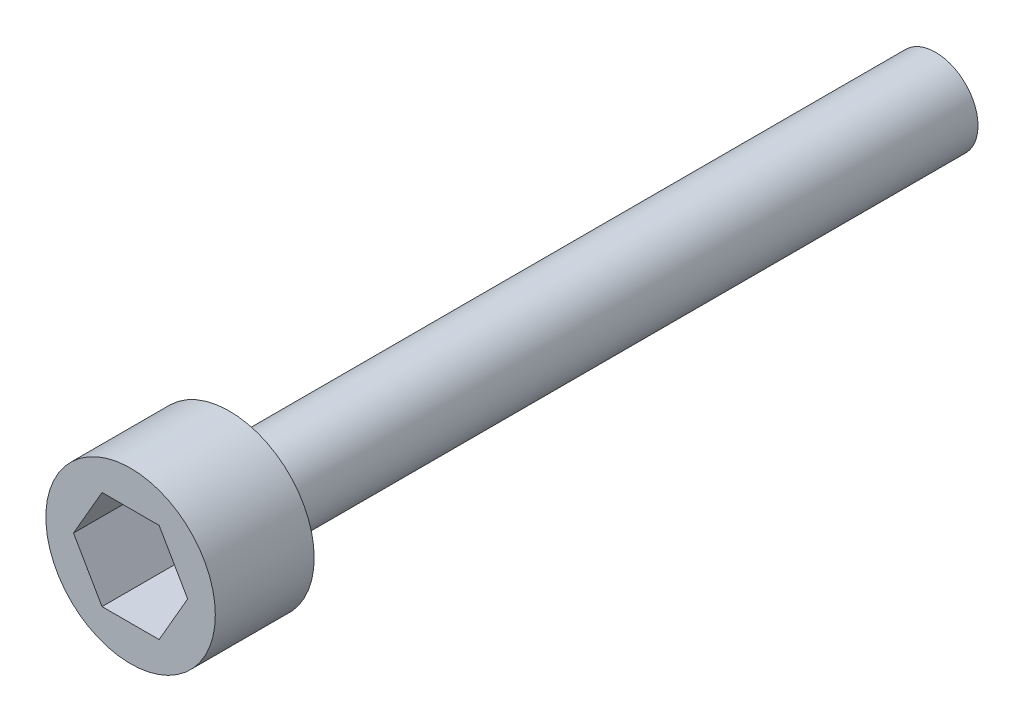
ISO-10303-21;
HEADER;
FILE_DESCRIPTION(('STEP AP214'),'2;1');
FILE_NAME('part.step','',(''),(''),'','','');
FILE_SCHEMA(('AUTOMOTIVE_DESIGN { 1 0 10303 214 1 1 1 1 }'));
ENDSEC;
DATA;
#1=APPLICATION_CONTEXT('core data for automotive mechanical design processes');
#2=APPLICATION_PROTOCOL_DEFINITION('international standard','automotive_design',2000,#1);
#3=PRODUCT_CONTEXT('',#1,'mechanical');
#4=PRODUCT('Part','Part','',(#3));
#5=PRODUCT_RELATED_PRODUCT_CATEGORY('part','',(#4));
#6=PRODUCT_DEFINITION_FORMATION('','',#4);
#7=PRODUCT_DEFINITION_CONTEXT('part definition',#1,'design');
#8=PRODUCT_DEFINITION('design','',#6,#7);
#9=PRODUCT_DEFINITION_SHAPE('','',#8);
#10=(LENGTH_UNIT() NAMED_UNIT(*) SI_UNIT(.MILLI.,.METRE.));
#11=(NAMED_UNIT(*) PLANE_ANGLE_UNIT() SI_UNIT($,.RADIAN.));
#12=(NAMED_UNIT(*) SI_UNIT($,.STERADIAN.) SOLID_ANGLE_UNIT());
#13=UNCERTAINTY_MEASURE_WITH_UNIT(LENGTH_MEASURE(1.E-05),#10,'distance_accuracy_value','');
#14=(GEOMETRIC_REPRESENTATION_CONTEXT(3) GLOBAL_UNCERTAINTY_ASSIGNED_CONTEXT((#13)) GLOBAL_UNIT_ASSIGNED_CONTEXT((#10,
#11,#12)) REPRESENTATION_CONTEXT('',''));
#15=CARTESIAN_POINT('',(0.,0.,0.));
#16=DIRECTION('',(0.,0.,1.));
#17=DIRECTION('',(1.,0.,0.));
#18=AXIS2_PLACEMENT_3D('',#15,#16,#17);
#19=CARTESIAN_POINT('',(0.,0.,3.5));
#20=DIRECTION('',(0.,0.,-1.));
#21=DIRECTION('',(-1.,0.,0.));
#22=AXIS2_PLACEMENT_3D('',#19,#20,#21);
#23=CYLINDRICAL_SURFACE('',#22,3.);
#24=CARTESIAN_POINT('',(0.,0.,3.5));
#25=DIRECTION('',(0.,0.,1.));
#26=DIRECTION('',(1.,0.,0.));
#27=AXIS2_PLACEMENT_3D('',#24,#25,#26);
#28=CIRCLE('',#27,3.);
#29=CARTESIAN_POINT('',(3.,0.,3.5));
#30=VERTEX_POINT('',#29);
#31=EDGE_CURVE('E11',#30,#30,#28,.T.);
#32=ORIENTED_EDGE('',*,*,#31,.F.);
#33=EDGE_LOOP('',(#32));
#34=FACE_BOUND('',#33,.T.);
#35=CARTESIAN_POINT('',(0.,0.,0.));
#36=DIRECTION('',(0.,0.,1.));
#37=DIRECTION('',(1.,0.,0.));
#38=AXIS2_PLACEMENT_3D('',#35,#36,#37);
#39=CIRCLE('',#38,3.);
#40=CARTESIAN_POINT('',(3.,0.,0.));
#41=VERTEX_POINT('',#40);
#42=EDGE_CURVE('E35',#41,#41,#39,.T.);
#43=ORIENTED_EDGE('',*,*,#42,.T.);
#44=EDGE_LOOP('',(#43));
#45=FACE_BOUND('',#44,.T.);
#46=ADVANCED_FACE('F32',(#34,#45),#23,.T.);
#47=CARTESIAN_POINT('',(0.,0.,3.5));
#48=DIRECTION('',(0.,0.,1.));
#49=DIRECTION('',(1.,0.,0.));
#50=AXIS2_PLACEMENT_3D('',#47,#48,#49);
#51=PLANE('',#50);
#52=DIRECTION('',(-0.499999999999528,-0.866025403784711,0.));
#53=VECTOR('',#52,1.);
#54=CARTESIAN_POINT('',(-2.02072594216261,2.1557411053031E-12,3.5));
#55=LINE('',#54,#53);
#56=CARTESIAN_POINT('',(-1.01036297108294,1.75000000000058,3.5));
#57=VERTEX_POINT('',#56);
#58=CARTESIAN_POINT('',(-2.02072594216261,2.15561075933568E-12,3.5));
#59=VERTEX_POINT('',#58);
#60=EDGE_CURVE('E46',#57,#59,#55,.T.);
#61=ORIENTED_EDGE('',*,*,#60,.F.);
#62=DIRECTION('',(-1.,-7.11024037944377E-13,0.));
#63=VECTOR('',#62,1.);
#64=CARTESIAN_POINT('',(-1.01036297108294,1.75000000000058,3.5));
#65=LINE('',#64,#63);
#66=CARTESIAN_POINT('',(1.01036297108301,1.75000000000202,3.5));
#67=VERTEX_POINT('',#66);
#68=EDGE_CURVE('E130',#67,#57,#65,.T.);
#69=ORIENTED_EDGE('',*,*,#68,.F.);
#70=DIRECTION('',(-0.50000000000043,0.86602540378419,0.));
#71=VECTOR('',#70,1.);
#72=CARTESIAN_POINT('',(1.01036297108301,1.75000000000202,3.5));
#73=LINE('',#72,#71);
#74=CARTESIAN_POINT('',(2.02072594216593,2.15574110530311E-12,3.5));
#75=VERTEX_POINT('',#74);
#76=EDGE_CURVE('E128',#75,#67,#73,.T.);
#77=ORIENTED_EDGE('',*,*,#76,.F.);
#78=DIRECTION('',(0.499999999999527,0.866025403784711,0.));
#79=VECTOR('',#78,1.);
#80=CARTESIAN_POINT('',(2.02072594216593,2.15574110530311E-12,3.5));
#81=LINE('',#80,#79);
#82=CARTESIAN_POINT('',(1.01036297108301,-1.75000000000192,3.5));
#83=VERTEX_POINT('',#82);
#84=EDGE_CURVE('E94',#83,#75,#81,.T.);
#85=ORIENTED_EDGE('',*,*,#84,.F.);
#86=DIRECTION('',(1.,7.11024037946673E-13,0.));
#87=VECTOR('',#86,1.);
#88=CARTESIAN_POINT('',(1.01036297108301,-1.75000000000192,3.5));
#89=LINE('',#88,#87);
#90=CARTESIAN_POINT('',(-1.01036297107642,-1.75000000000336,3.5));
#91=VERTEX_POINT('',#90);
#92=EDGE_CURVE('E124',#91,#83,#89,.T.);
#93=ORIENTED_EDGE('',*,*,#92,.F.);
#94=DIRECTION('',(0.500000000000431,-0.86602540378419,0.));
#95=VECTOR('',#94,1.);
#96=CARTESIAN_POINT('',(-1.01036297107642,-1.75000000000336,3.5));
#97=LINE('',#96,#95);
#98=EDGE_CURVE('E120',#59,#91,#97,.T.);
#99=ORIENTED_EDGE('',*,*,#98,.F.);
#100=EDGE_LOOP('',(#61,#69,#77,#85,#93,#99));
#101=FACE_BOUND('',#100,.T.);
#102=ORIENTED_EDGE('',*,*,#31,.T.);
#103=EDGE_LOOP('',(#102));
#104=FACE_BOUND('',#103,.T.);
#105=ADVANCED_FACE('F143',(#101,#104),#51,.T.);
#106=CARTESIAN_POINT('',(0.,0.,0.));
#107=DIRECTION('',(0.,0.,1.));
#108=DIRECTION('',(1.,0.,0.));
#109=AXIS2_PLACEMENT_3D('',#106,#107,#108);
#110=PLANE('',#109);
#111=CARTESIAN_POINT('',(0.,0.,0.));
#112=DIRECTION('',(0.,0.,1.));
#113=DIRECTION('',(1.,0.,0.));
#114=AXIS2_PLACEMENT_3D('',#111,#112,#113);
#115=CIRCLE('',#114,1.5);
#116=CARTESIAN_POINT('',(1.5,0.,0.));
#117=VERTEX_POINT('',#116);
#118=EDGE_CURVE('E150',#117,#117,#115,.T.);
#119=ORIENTED_EDGE('',*,*,#118,.T.);
#120=EDGE_LOOP('',(#119));
#121=FACE_BOUND('',#120,.T.);
#122=ORIENTED_EDGE('',*,*,#42,.F.);
#123=EDGE_LOOP('',(#122));
#124=FACE_BOUND('',#123,.T.);
#125=ADVANCED_FACE('F171',(#121,#124),#110,.F.);
#126=CARTESIAN_POINT('',(-2.02072594216261,2.1557411053031E-12,0.7));
#127=DIRECTION('',(-0.866025403784711,0.499999999999528,0.));
#128=DIRECTION('',(-0.499999999999528,-0.866025403784711,0.));
#129=AXIS2_PLACEMENT_3D('',#126,#127,#128);
#130=PLANE('',#129);
#131=ORIENTED_EDGE('',*,*,#60,.T.);
#132=DIRECTION('',(0.,0.,1.));
#133=VECTOR('',#132,1.);
#134=CARTESIAN_POINT('',(-2.02072594216261,2.1557411053031E-12,0.7));
#135=LINE('',#134,#133);
#136=CARTESIAN_POINT('',(-2.02072594216261,2.1557411053031E-12,0.7));
#137=VERTEX_POINT('',#136);
#138=EDGE_CURVE('E76',#137,#59,#135,.T.);
#139=ORIENTED_EDGE('',*,*,#138,.F.);
#140=DIRECTION('',(-0.499999999999528,-0.866025403784711,0.));
#141=VECTOR('',#140,1.);
#142=CARTESIAN_POINT('',(-2.02072594216261,2.1557411053031E-12,0.7));
#143=LINE('',#142,#141);
#144=CARTESIAN_POINT('',(-1.01036297108294,1.75000000000058,0.7));
#145=VERTEX_POINT('',#144);
#146=EDGE_CURVE('E132',#145,#137,#143,.T.);
#147=ORIENTED_EDGE('',*,*,#146,.F.);
#148=DIRECTION('',(0.,0.,1.));
#149=VECTOR('',#148,1.);
#150=CARTESIAN_POINT('',(-1.01036297108294,1.75000000000058,0.7));
#151=LINE('',#150,#149);
#152=EDGE_CURVE('E54',#145,#57,#151,.T.);
#153=ORIENTED_EDGE('',*,*,#152,.T.);
#154=EDGE_LOOP('',(#131,#139,#147,#153));
#155=FACE_BOUND('',#154,.T.);
#156=ADVANCED_FACE('F179',(#155),#130,.F.);
#157=CARTESIAN_POINT('',(-1.01036297108294,1.75000000000058,0.7));
#158=DIRECTION('',(-7.11024037944377E-13,1.,0.));
#159=DIRECTION('',(-1.,-7.11024037944377E-13,0.));
#160=AXIS2_PLACEMENT_3D('',#157,#158,#159);
#161=PLANE('',#160);
#162=ORIENTED_EDGE('',*,*,#68,.T.);
#163=ORIENTED_EDGE('',*,*,#152,.F.);
#164=DIRECTION('',(-1.,-7.11024037944377E-13,0.));
#165=VECTOR('',#164,1.);
#166=CARTESIAN_POINT('',(-1.01036297108294,1.75000000000058,0.7));
#167=LINE('',#166,#165);
#168=CARTESIAN_POINT('',(1.01036297108301,1.75000000000202,0.7));
#169=VERTEX_POINT('',#168);
#170=EDGE_CURVE('E106',#169,#145,#167,.T.);
#171=ORIENTED_EDGE('',*,*,#170,.F.);
#172=DIRECTION('',(0.,0.,1.));
#173=VECTOR('',#172,1.);
#174=CARTESIAN_POINT('',(1.01036297108301,1.75000000000202,0.7));
#175=LINE('',#174,#173);
#176=EDGE_CURVE('E98',#169,#67,#175,.T.);
#177=ORIENTED_EDGE('',*,*,#176,.T.);
#178=EDGE_LOOP('',(#162,#163,#171,#177));
#179=FACE_BOUND('',#178,.T.);
#180=ADVANCED_FACE('F184',(#179),#161,.F.);
#181=CARTESIAN_POINT('',(1.01036297108301,1.75000000000202,0.7));
#182=DIRECTION('',(0.86602540378419,0.50000000000043,0.));
#183=DIRECTION('',(-0.50000000000043,0.86602540378419,0.));
#184=AXIS2_PLACEMENT_3D('',#181,#182,#183);
#185=PLANE('',#184);
#186=ORIENTED_EDGE('',*,*,#76,.T.);
#187=ORIENTED_EDGE('',*,*,#176,.F.);
#188=DIRECTION('',(-0.50000000000043,0.86602540378419,0.));
#189=VECTOR('',#188,1.);
#190=CARTESIAN_POINT('',(1.01036297108301,1.75000000000202,0.7));
#191=LINE('',#190,#189);
#192=CARTESIAN_POINT('',(2.02072594216593,2.15574110530311E-12,0.7));
#193=VERTEX_POINT('',#192);
#194=EDGE_CURVE('E102',#193,#169,#191,.T.);
#195=ORIENTED_EDGE('',*,*,#194,.F.);
#196=DIRECTION('',(0.,0.,1.));
#197=VECTOR('',#196,1.);
#198=CARTESIAN_POINT('',(2.02072594216593,2.15574110530311E-12,0.7));
#199=LINE('',#198,#197);
#200=EDGE_CURVE('E87',#193,#75,#199,.T.);
#201=ORIENTED_EDGE('',*,*,#200,.T.);
#202=EDGE_LOOP('',(#186,#187,#195,#201));
#203=FACE_BOUND('',#202,.T.);
#204=ADVANCED_FACE('F103',(#203),#185,.F.);
#205=CARTESIAN_POINT('',(2.02072594216593,2.15574110530311E-12,0.7));
#206=DIRECTION('',(0.866025403784712,-0.499999999999527,0.));
#207=DIRECTION('',(0.499999999999527,0.866025403784712,0.));
#208=AXIS2_PLACEMENT_3D('',#205,#206,#207);
#209=PLANE('',#208);
#210=ORIENTED_EDGE('',*,*,#84,.T.);
#211=ORIENTED_EDGE('',*,*,#200,.F.);
#212=DIRECTION('',(0.499999999999527,0.866025403784711,0.));
#213=VECTOR('',#212,1.);
#214=CARTESIAN_POINT('',(2.02072594216593,2.15574110530311E-12,0.7));
#215=LINE('',#214,#213);
#216=CARTESIAN_POINT('',(1.01036297108301,-1.75000000000192,0.7));
#217=VERTEX_POINT('',#216);
#218=EDGE_CURVE('E91',#217,#193,#215,.T.);
#219=ORIENTED_EDGE('',*,*,#218,.F.);
#220=DIRECTION('',(0.,0.,1.));
#221=VECTOR('',#220,1.);
#222=CARTESIAN_POINT('',(1.01036297108301,-1.75000000000192,0.7));
#223=LINE('',#222,#221);
#224=EDGE_CURVE('E99',#217,#83,#223,.T.);
#225=ORIENTED_EDGE('',*,*,#224,.T.);
#226=EDGE_LOOP('',(#210,#211,#219,#225));
#227=FACE_BOUND('',#226,.T.);
#228=ADVANCED_FACE('F89',(#227),#209,.F.);
#229=CARTESIAN_POINT('',(1.01036297108301,-1.75000000000192,0.7));
#230=DIRECTION('',(7.11024037946673E-13,-1.,0.));
#231=DIRECTION('',(1.,7.11024037946673E-13,0.));
#232=AXIS2_PLACEMENT_3D('',#229,#230,#231);
#233=PLANE('',#232);
#234=ORIENTED_EDGE('',*,*,#92,.T.);
#235=ORIENTED_EDGE('',*,*,#224,.F.);
#236=DIRECTION('',(1.,7.11024037946673E-13,0.));
#237=VECTOR('',#236,1.);
#238=CARTESIAN_POINT('',(1.01036297108301,-1.75000000000192,0.7));
#239=LINE('',#238,#237);
#240=CARTESIAN_POINT('',(-1.01036297107642,-1.75000000000336,0.7));
#241=VERTEX_POINT('',#240);
#242=EDGE_CURVE('E112',#241,#217,#239,.T.);
#243=ORIENTED_EDGE('',*,*,#242,.F.);
#244=DIRECTION('',(0.,0.,1.));
#245=VECTOR('',#244,1.);
#246=CARTESIAN_POINT('',(-1.01036297107642,-1.75000000000336,0.7));
#247=LINE('',#246,#245);
#248=EDGE_CURVE('E136',#241,#91,#247,.T.);
#249=ORIENTED_EDGE('',*,*,#248,.T.);
#250=EDGE_LOOP('',(#234,#235,#243,#249));
#251=FACE_BOUND('',#250,.T.);
#252=ADVANCED_FACE('F147',(#251),#233,.F.);
#253=CARTESIAN_POINT('',(-1.01036297107642,-1.75000000000336,0.7));
#254=DIRECTION('',(-0.86602540378419,-0.500000000000431,0.));
#255=DIRECTION('',(0.500000000000431,-0.86602540378419,0.));
#256=AXIS2_PLACEMENT_3D('',#253,#254,#255);
#257=PLANE('',#256);
#258=ORIENTED_EDGE('',*,*,#98,.T.);
#259=ORIENTED_EDGE('',*,*,#248,.F.);
#260=DIRECTION('',(0.500000000000431,-0.86602540378419,0.));
#261=VECTOR('',#260,1.);
#262=CARTESIAN_POINT('',(-1.01036297107642,-1.75000000000336,0.7));
#263=LINE('',#262,#261);
#264=EDGE_CURVE('E114',#137,#241,#263,.T.);
#265=ORIENTED_EDGE('',*,*,#264,.F.);
#266=ORIENTED_EDGE('',*,*,#138,.T.);
#267=EDGE_LOOP('',(#258,#259,#265,#266));
#268=FACE_BOUND('',#267,.T.);
#269=ADVANCED_FACE('F140',(#268),#257,.F.);
#270=CARTESIAN_POINT('',(-1.01036297108294,1.75000000000058,0.7));
#271=DIRECTION('',(0.,0.,-1.));
#272=DIRECTION('',(-1.,0.,0.));
#273=AXIS2_PLACEMENT_3D('',#270,#271,#272);
#274=PLANE('',#273);
#275=ORIENTED_EDGE('',*,*,#146,.T.);
#276=ORIENTED_EDGE('',*,*,#264,.T.);
#277=ORIENTED_EDGE('',*,*,#242,.T.);
#278=ORIENTED_EDGE('',*,*,#218,.T.);
#279=ORIENTED_EDGE('',*,*,#194,.T.);
#280=ORIENTED_EDGE('',*,*,#170,.T.);
#281=EDGE_LOOP('',(#275,#276,#277,#278,#279,#280));
#282=FACE_BOUND('',#281,.T.);
#283=ADVANCED_FACE('F109',(#282),#274,.F.);
#284=CARTESIAN_POINT('',(0.,0.,-25.));
#285=DIRECTION('',(0.,0.,1.));
#286=DIRECTION('',(1.,0.,0.));
#287=AXIS2_PLACEMENT_3D('',#284,#285,#286);
#288=CYLINDRICAL_SURFACE('',#287,1.5);
#289=CARTESIAN_POINT('',(0.,0.,-25.));
#290=DIRECTION('',(0.,0.,1.));
#291=DIRECTION('',(1.,0.,0.));
#292=AXIS2_PLACEMENT_3D('',#289,#290,#291);
#293=CIRCLE('',#292,1.5);
#294=CARTESIAN_POINT('',(1.5,0.,-25.));
#295=VERTEX_POINT('',#294);
#296=EDGE_CURVE('E121',#295,#295,#293,.T.);
#297=ORIENTED_EDGE('',*,*,#296,.T.);
#298=EDGE_LOOP('',(#297));
#299=FACE_BOUND('',#298,.T.);
#300=ORIENTED_EDGE('',*,*,#118,.F.);
#301=EDGE_LOOP('',(#300));
#302=FACE_BOUND('',#301,.T.);
#303=ADVANCED_FACE('F156',(#299,#302),#288,.T.);
#304=CARTESIAN_POINT('',(0.,0.,-25.));
#305=DIRECTION('',(0.,0.,1.));
#306=DIRECTION('',(1.,0.,0.));
#307=AXIS2_PLACEMENT_3D('',#304,#305,#306);
#308=PLANE('',#307);
#309=ORIENTED_EDGE('',*,*,#296,.F.);
#310=EDGE_LOOP('',(#309));
#311=FACE_BOUND('',#310,.T.);
#312=ADVANCED_FACE('F159',(#311),#308,.F.);
#313=CLOSED_SHELL('',(#46,#105,#125,#156,#180,#204,#228,#252,#269,#283,#303,#312));
#314=MANIFOLD_SOLID_BREP('B2',#313);
#315=ADVANCED_BREP_SHAPE_REPRESENTATION('',(#18,#314),#14);
#316=SHAPE_DEFINITION_REPRESENTATION(#9,#315);
ENDSEC;
END-ISO-10303-21;
